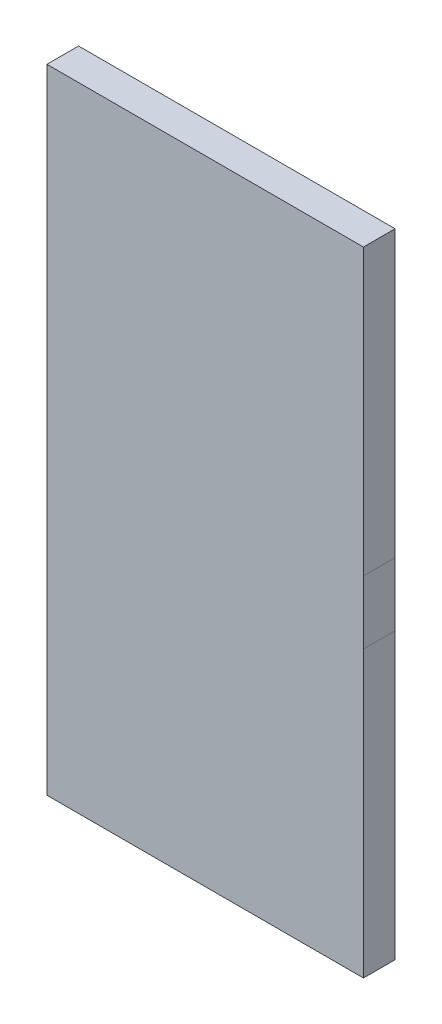
ISO-10303-21;
HEADER;
FILE_DESCRIPTION(('STEP AP214'),'2;1');
FILE_NAME('part.step','',(''),(''),'','','');
FILE_SCHEMA(('AUTOMOTIVE_DESIGN { 1 0 10303 214 1 1 1 1 }'));
ENDSEC;
DATA;
#1=APPLICATION_CONTEXT('core data for automotive mechanical design processes');
#2=APPLICATION_PROTOCOL_DEFINITION('international standard','automotive_design',2000,#1);
#3=PRODUCT_CONTEXT('',#1,'mechanical');
#4=PRODUCT('Part','Part','',(#3));
#5=PRODUCT_RELATED_PRODUCT_CATEGORY('part','',(#4));
#6=PRODUCT_DEFINITION_FORMATION('','',#4);
#7=PRODUCT_DEFINITION_CONTEXT('part definition',#1,'design');
#8=PRODUCT_DEFINITION('design','',#6,#7);
#9=PRODUCT_DEFINITION_SHAPE('','',#8);
#10=(LENGTH_UNIT() NAMED_UNIT(*) SI_UNIT(.MILLI.,.METRE.));
#11=(NAMED_UNIT(*) PLANE_ANGLE_UNIT() SI_UNIT($,.RADIAN.));
#12=(NAMED_UNIT(*) SI_UNIT($,.STERADIAN.) SOLID_ANGLE_UNIT());
#13=UNCERTAINTY_MEASURE_WITH_UNIT(LENGTH_MEASURE(1.E-05),#10,'distance_accuracy_value','');
#14=(GEOMETRIC_REPRESENTATION_CONTEXT(3) GLOBAL_UNCERTAINTY_ASSIGNED_CONTEXT((#13)) GLOBAL_UNIT_ASSIGNED_CONTEXT((#10,
#11,#12)) REPRESENTATION_CONTEXT('',''));
#15=CARTESIAN_POINT('',(0.,0.,0.));
#16=DIRECTION('',(0.,0.,1.));
#17=DIRECTION('',(1.,0.,0.));
#18=AXIS2_PLACEMENT_3D('',#15,#16,#17);
#19=CARTESIAN_POINT('',(1000.,0.,100.));
#20=DIRECTION('',(-1.,0.,0.));
#21=DIRECTION('',(0.,0.,1.));
#22=AXIS2_PLACEMENT_3D('',#19,#20,#21);
#23=PLANE('',#22);
#24=DIRECTION('',(0.,0.,-1.));
#25=VECTOR('',#24,1.);
#26=CARTESIAN_POINT('',(1000.,1100.,100.));
#27=LINE('',#26,#25);
#28=CARTESIAN_POINT('',(1000.,1100.,100.));
#29=VERTEX_POINT('',#28);
#30=CARTESIAN_POINT('',(1000.,1100.,0.));
#31=VERTEX_POINT('',#30);
#32=EDGE_CURVE('E11',#29,#31,#27,.T.);
#33=ORIENTED_EDGE('',*,*,#32,.F.);
#34=DIRECTION('',(0.,1.,0.));
#35=VECTOR('',#34,1.);
#36=CARTESIAN_POINT('',(1000.,0.,100.));
#37=LINE('',#36,#35);
#38=CARTESIAN_POINT('',(1000.,900.,100.));
#39=VERTEX_POINT('',#38);
#40=EDGE_CURVE('E135',#39,#29,#37,.T.);
#41=ORIENTED_EDGE('',*,*,#40,.F.);
#42=DIRECTION('',(0.,0.,-1.));
#43=VECTOR('',#42,1.);
#44=CARTESIAN_POINT('',(1000.,900.,100.));
#45=LINE('',#44,#43);
#46=CARTESIAN_POINT('',(1000.,900.,0.));
#47=VERTEX_POINT('',#46);
#48=EDGE_CURVE('E48',#39,#47,#45,.T.);
#49=ORIENTED_EDGE('',*,*,#48,.T.);
#50=DIRECTION('',(0.,1.,0.));
#51=VECTOR('',#50,1.);
#52=CARTESIAN_POINT('',(1000.,0.,0.));
#53=LINE('',#52,#51);
#54=EDGE_CURVE('E128',#47,#31,#53,.T.);
#55=ORIENTED_EDGE('',*,*,#54,.T.);
#56=EDGE_LOOP('',(#33,#41,#49,#55));
#57=FACE_BOUND('',#56,.T.);
#58=ADVANCED_FACE('F39',(#57),#23,.F.);
#59=ORIENTED_EDGE('',*,*,#48,.F.);
#60=CARTESIAN_POINT('',(1000.,0.,100.));
#61=VERTEX_POINT('',#60);
#62=EDGE_CURVE('E134',#61,#39,#37,.T.);
#63=ORIENTED_EDGE('',*,*,#62,.F.);
#64=DIRECTION('',(0.,0.,-1.));
#65=VECTOR('',#64,1.);
#66=CARTESIAN_POINT('',(1000.,0.,100.));
#67=LINE('',#66,#65);
#68=CARTESIAN_POINT('',(1000.,0.,0.));
#69=VERTEX_POINT('',#68);
#70=EDGE_CURVE('E97',#61,#69,#67,.T.);
#71=ORIENTED_EDGE('',*,*,#70,.T.);
#72=EDGE_CURVE('E125',#69,#47,#53,.T.);
#73=ORIENTED_EDGE('',*,*,#72,.T.);
#74=EDGE_LOOP('',(#59,#63,#71,#73));
#75=FACE_BOUND('',#74,.T.);
#76=ADVANCED_FACE('F147',(#75),#23,.F.);
#77=CARTESIAN_POINT('',(0.,0.,100.));
#78=DIRECTION('',(1.,0.,0.));
#79=DIRECTION('',(0.,0.,-1.));
#80=AXIS2_PLACEMENT_3D('',#77,#78,#79);
#81=PLANE('',#80);
#82=DIRECTION('',(0.,-1.,0.));
#83=VECTOR('',#82,1.);
#84=CARTESIAN_POINT('',(0.,0.,0.));
#85=LINE('',#84,#83);
#86=CARTESIAN_POINT('',(0.,2000.,0.));
#87=VERTEX_POINT('',#86);
#88=CARTESIAN_POINT('',(0.,0.,0.));
#89=VERTEX_POINT('',#88);
#90=EDGE_CURVE('E114',#87,#89,#85,.T.);
#91=ORIENTED_EDGE('',*,*,#90,.T.);
#92=DIRECTION('',(0.,0.,-1.));
#93=VECTOR('',#92,1.);
#94=CARTESIAN_POINT('',(0.,0.,100.));
#95=LINE('',#94,#93);
#96=CARTESIAN_POINT('',(0.,0.,100.));
#97=VERTEX_POINT('',#96);
#98=EDGE_CURVE('E94',#97,#89,#95,.T.);
#99=ORIENTED_EDGE('',*,*,#98,.F.);
#100=DIRECTION('',(0.,-1.,0.));
#101=VECTOR('',#100,1.);
#102=CARTESIAN_POINT('',(0.,0.,100.));
#103=LINE('',#102,#101);
#104=CARTESIAN_POINT('',(0.,2000.,100.));
#105=VERTEX_POINT('',#104);
#106=EDGE_CURVE('E102',#105,#97,#103,.T.);
#107=ORIENTED_EDGE('',*,*,#106,.F.);
#108=DIRECTION('',(0.,0.,-1.));
#109=VECTOR('',#108,1.);
#110=CARTESIAN_POINT('',(0.,2000.,100.));
#111=LINE('',#110,#109);
#112=EDGE_CURVE('E122',#105,#87,#111,.T.);
#113=ORIENTED_EDGE('',*,*,#112,.T.);
#114=EDGE_LOOP('',(#91,#99,#107,#113));
#115=FACE_BOUND('',#114,.T.);
#116=ADVANCED_FACE('F41',(#115),#81,.F.);
#117=CARTESIAN_POINT('',(0.,0.,100.));
#118=DIRECTION('',(0.,1.,0.));
#119=DIRECTION('',(0.,0.,1.));
#120=AXIS2_PLACEMENT_3D('',#117,#118,#119);
#121=PLANE('',#120);
#122=DIRECTION('',(1.,0.,0.));
#123=VECTOR('',#122,1.);
#124=CARTESIAN_POINT('',(0.,0.,0.));
#125=LINE('',#124,#123);
#126=EDGE_CURVE('E130',#89,#69,#125,.T.);
#127=ORIENTED_EDGE('',*,*,#126,.T.);
#128=ORIENTED_EDGE('',*,*,#70,.F.);
#129=DIRECTION('',(1.,0.,0.));
#130=VECTOR('',#129,1.);
#131=CARTESIAN_POINT('',(0.,0.,100.));
#132=LINE('',#131,#130);
#133=EDGE_CURVE('E90',#97,#61,#132,.T.);
#134=ORIENTED_EDGE('',*,*,#133,.F.);
#135=ORIENTED_EDGE('',*,*,#98,.T.);
#136=EDGE_LOOP('',(#127,#128,#134,#135));
#137=FACE_BOUND('',#136,.T.);
#138=ADVANCED_FACE('F92',(#137),#121,.F.);
#139=CARTESIAN_POINT('',(1000.,2000.,100.));
#140=VERTEX_POINT('',#139);
#141=EDGE_CURVE('E101',#29,#140,#37,.T.);
#142=ORIENTED_EDGE('',*,*,#141,.F.);
#143=ORIENTED_EDGE('',*,*,#32,.T.);
#144=CARTESIAN_POINT('',(1000.,2000.,0.));
#145=VERTEX_POINT('',#144);
#146=EDGE_CURVE('E129',#31,#145,#53,.T.);
#147=ORIENTED_EDGE('',*,*,#146,.T.);
#148=DIRECTION('',(0.,0.,-1.));
#149=VECTOR('',#148,1.);
#150=CARTESIAN_POINT('',(1000.,2000.,100.));
#151=LINE('',#150,#149);
#152=EDGE_CURVE('E117',#140,#145,#151,.T.);
#153=ORIENTED_EDGE('',*,*,#152,.F.);
#154=EDGE_LOOP('',(#142,#143,#147,#153));
#155=FACE_BOUND('',#154,.T.);
#156=ADVANCED_FACE('F138',(#155),#23,.F.);
#157=CARTESIAN_POINT('',(0.,2000.,100.));
#158=DIRECTION('',(0.,-1.,0.));
#159=DIRECTION('',(0.,0.,-1.));
#160=AXIS2_PLACEMENT_3D('',#157,#158,#159);
#161=PLANE('',#160);
#162=DIRECTION('',(-1.,0.,0.));
#163=VECTOR('',#162,1.);
#164=CARTESIAN_POINT('',(0.,2000.,0.));
#165=LINE('',#164,#163);
#166=EDGE_CURVE('E111',#145,#87,#165,.T.);
#167=ORIENTED_EDGE('',*,*,#166,.T.);
#168=ORIENTED_EDGE('',*,*,#112,.F.);
#169=DIRECTION('',(-1.,0.,0.));
#170=VECTOR('',#169,1.);
#171=CARTESIAN_POINT('',(0.,2000.,100.));
#172=LINE('',#171,#170);
#173=EDGE_CURVE('E107',#140,#105,#172,.T.);
#174=ORIENTED_EDGE('',*,*,#173,.F.);
#175=ORIENTED_EDGE('',*,*,#152,.T.);
#176=EDGE_LOOP('',(#167,#168,#174,#175));
#177=FACE_BOUND('',#176,.T.);
#178=ADVANCED_FACE('F141',(#177),#161,.F.);
#179=CARTESIAN_POINT('',(0.,0.,100.));
#180=DIRECTION('',(0.,0.,-1.));
#181=DIRECTION('',(-1.,0.,0.));
#182=AXIS2_PLACEMENT_3D('',#179,#180,#181);
#183=PLANE('',#182);
#184=ORIENTED_EDGE('',*,*,#106,.T.);
#185=ORIENTED_EDGE('',*,*,#133,.T.);
#186=ORIENTED_EDGE('',*,*,#62,.T.);
#187=ORIENTED_EDGE('',*,*,#40,.T.);
#188=ORIENTED_EDGE('',*,*,#141,.T.);
#189=ORIENTED_EDGE('',*,*,#173,.T.);
#190=EDGE_LOOP('',(#184,#185,#186,#187,#188,#189));
#191=FACE_BOUND('',#190,.T.);
#192=ADVANCED_FACE('F105',(#191),#183,.F.);
#193=CARTESIAN_POINT('',(0.,0.,0.));
#194=DIRECTION('',(0.,0.,-1.));
#195=DIRECTION('',(-1.,0.,0.));
#196=AXIS2_PLACEMENT_3D('',#193,#194,#195);
#197=PLANE('',#196);
#198=ORIENTED_EDGE('',*,*,#90,.F.);
#199=ORIENTED_EDGE('',*,*,#166,.F.);
#200=ORIENTED_EDGE('',*,*,#146,.F.);
#201=ORIENTED_EDGE('',*,*,#54,.F.);
#202=ORIENTED_EDGE('',*,*,#72,.F.);
#203=ORIENTED_EDGE('',*,*,#126,.F.);
#204=EDGE_LOOP('',(#198,#199,#200,#201,#202,#203));
#205=FACE_BOUND('',#204,.T.);
#206=ADVANCED_FACE('F143',(#205),#197,.T.);
#207=CLOSED_SHELL('',(#58,#76,#116,#138,#156,#178,#192,#206));
#208=MANIFOLD_SOLID_BREP('B2',#207);
#209=ADVANCED_BREP_SHAPE_REPRESENTATION('',(#18,#208),#14);
#210=SHAPE_DEFINITION_REPRESENTATION(#9,#209);
ENDSEC;
END-ISO-10303-21;
